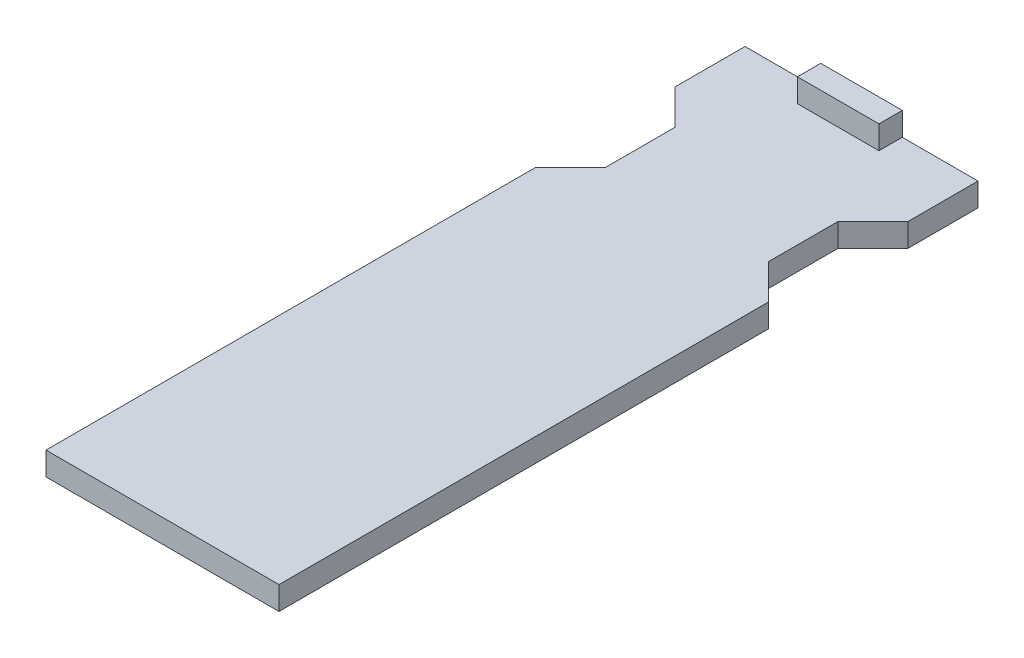
ISO-10303-21;
HEADER;
FILE_DESCRIPTION(('STEP AP214'),'2;1');
FILE_NAME('part.step','',(''),(''),'','','');
FILE_SCHEMA(('AUTOMOTIVE_DESIGN { 1 0 10303 214 1 1 1 1 }'));
ENDSEC;
DATA;
#1=APPLICATION_CONTEXT('core data for automotive mechanical design processes');
#2=APPLICATION_PROTOCOL_DEFINITION('international standard','automotive_design',2000,#1);
#3=PRODUCT_CONTEXT('',#1,'mechanical');
#4=PRODUCT('Part','Part','',(#3));
#5=PRODUCT_RELATED_PRODUCT_CATEGORY('part','',(#4));
#6=PRODUCT_DEFINITION_FORMATION('','',#4);
#7=PRODUCT_DEFINITION_CONTEXT('part definition',#1,'design');
#8=PRODUCT_DEFINITION('design','',#6,#7);
#9=PRODUCT_DEFINITION_SHAPE('','',#8);
#10=(LENGTH_UNIT() NAMED_UNIT(*) SI_UNIT(.MILLI.,.METRE.));
#11=(NAMED_UNIT(*) PLANE_ANGLE_UNIT() SI_UNIT($,.RADIAN.));
#12=(NAMED_UNIT(*) SI_UNIT($,.STERADIAN.) SOLID_ANGLE_UNIT());
#13=UNCERTAINTY_MEASURE_WITH_UNIT(LENGTH_MEASURE(1.E-05),#10,'distance_accuracy_value','');
#14=(GEOMETRIC_REPRESENTATION_CONTEXT(3) GLOBAL_UNCERTAINTY_ASSIGNED_CONTEXT((#13)) GLOBAL_UNIT_ASSIGNED_CONTEXT((#10,
#11,#12)) REPRESENTATION_CONTEXT('',''));
#15=CARTESIAN_POINT('',(0.,0.,0.));
#16=DIRECTION('',(0.,0.,1.));
#17=DIRECTION('',(1.,0.,0.));
#18=AXIS2_PLACEMENT_3D('',#15,#16,#17);
#19=CARTESIAN_POINT('',(6.5,4.,-60.));
#20=DIRECTION('',(1.,0.,0.));
#21=DIRECTION('',(0.,0.,-1.));
#22=AXIS2_PLACEMENT_3D('',#19,#20,#21);
#23=PLANE('',#22);
#24=DIRECTION('',(0.,0.,1.));
#25=VECTOR('',#24,1.);
#26=CARTESIAN_POINT('',(6.5,2.,-60.));
#27=LINE('',#26,#25);
#28=CARTESIAN_POINT('',(6.5,2.,-60.));
#29=VERTEX_POINT('',#28);
#30=CARTESIAN_POINT('',(6.5,2.,-58.));
#31=VERTEX_POINT('',#30);
#32=EDGE_CURVE('E108',#29,#31,#27,.T.);
#33=ORIENTED_EDGE('',*,*,#32,.T.);
#34=DIRECTION('',(0.,-1.,0.));
#35=VECTOR('',#34,1.);
#36=CARTESIAN_POINT('',(6.5,4.,-58.));
#37=LINE('',#36,#35);
#38=CARTESIAN_POINT('',(6.5,4.,-58.));
#39=VERTEX_POINT('',#38);
#40=EDGE_CURVE('E12',#39,#31,#37,.T.);
#41=ORIENTED_EDGE('',*,*,#40,.F.);
#42=DIRECTION('',(0.,0.,1.));
#43=VECTOR('',#42,1.);
#44=CARTESIAN_POINT('',(6.5,4.,-60.));
#45=LINE('',#44,#43);
#46=CARTESIAN_POINT('',(6.5,4.,-60.));
#47=VERTEX_POINT('',#46);
#48=EDGE_CURVE('E96',#47,#39,#45,.T.);
#49=ORIENTED_EDGE('',*,*,#48,.F.);
#50=DIRECTION('',(0.,-1.,0.));
#51=VECTOR('',#50,1.);
#52=CARTESIAN_POINT('',(6.5,4.,-60.));
#53=LINE('',#52,#51);
#54=EDGE_CURVE('E104',#47,#29,#53,.T.);
#55=ORIENTED_EDGE('',*,*,#54,.T.);
#56=EDGE_LOOP('',(#33,#41,#49,#55));
#57=FACE_BOUND('',#56,.T.);
#58=ADVANCED_FACE('F45',(#57),#23,.F.);
#59=CARTESIAN_POINT('',(6.5,4.,-58.));
#60=DIRECTION('',(0.,0.,-1.));
#61=DIRECTION('',(-1.,0.,0.));
#62=AXIS2_PLACEMENT_3D('',#59,#60,#61);
#63=PLANE('',#62);
#64=DIRECTION('',(1.,0.,0.));
#65=VECTOR('',#64,1.);
#66=CARTESIAN_POINT('',(6.5,2.,-58.));
#67=LINE('',#66,#65);
#68=CARTESIAN_POINT('',(13.5,2.,-58.));
#69=VERTEX_POINT('',#68);
#70=EDGE_CURVE('E100',#31,#69,#67,.T.);
#71=ORIENTED_EDGE('',*,*,#70,.T.);
#72=DIRECTION('',(0.,-1.,0.));
#73=VECTOR('',#72,1.);
#74=CARTESIAN_POINT('',(13.5,4.,-58.));
#75=LINE('',#74,#73);
#76=CARTESIAN_POINT('',(13.5,4.,-58.));
#77=VERTEX_POINT('',#76);
#78=EDGE_CURVE('E53',#77,#69,#75,.T.);
#79=ORIENTED_EDGE('',*,*,#78,.F.);
#80=DIRECTION('',(1.,0.,0.));
#81=VECTOR('',#80,1.);
#82=CARTESIAN_POINT('',(6.5,4.,-58.));
#83=LINE('',#82,#81);
#84=EDGE_CURVE('E91',#39,#77,#83,.T.);
#85=ORIENTED_EDGE('',*,*,#84,.F.);
#86=ORIENTED_EDGE('',*,*,#40,.T.);
#87=EDGE_LOOP('',(#71,#79,#85,#86));
#88=FACE_BOUND('',#87,.T.);
#89=ADVANCED_FACE('F99',(#88),#63,.F.);
#90=CARTESIAN_POINT('',(13.5,4.,-60.));
#91=DIRECTION('',(-1.,0.,0.));
#92=DIRECTION('',(0.,0.,1.));
#93=AXIS2_PLACEMENT_3D('',#90,#91,#92);
#94=PLANE('',#93);
#95=DIRECTION('',(0.,0.,-1.));
#96=VECTOR('',#95,1.);
#97=CARTESIAN_POINT('',(13.5,2.,-60.));
#98=LINE('',#97,#96);
#99=CARTESIAN_POINT('',(13.5,2.,-60.));
#100=VERTEX_POINT('',#99);
#101=EDGE_CURVE('E78',#69,#100,#98,.T.);
#102=ORIENTED_EDGE('',*,*,#101,.T.);
#103=DIRECTION('',(0.,-1.,0.));
#104=VECTOR('',#103,1.);
#105=CARTESIAN_POINT('',(13.5,4.,-60.));
#106=LINE('',#105,#104);
#107=CARTESIAN_POINT('',(13.5,4.,-60.));
#108=VERTEX_POINT('',#107);
#109=EDGE_CURVE('E101',#108,#100,#106,.T.);
#110=ORIENTED_EDGE('',*,*,#109,.F.);
#111=DIRECTION('',(0.,0.,-1.));
#112=VECTOR('',#111,1.);
#113=CARTESIAN_POINT('',(13.5,4.,-60.));
#114=LINE('',#113,#112);
#115=EDGE_CURVE('E94',#77,#108,#114,.T.);
#116=ORIENTED_EDGE('',*,*,#115,.F.);
#117=ORIENTED_EDGE('',*,*,#78,.T.);
#118=EDGE_LOOP('',(#102,#110,#116,#117));
#119=FACE_BOUND('',#118,.T.);
#120=ADVANCED_FACE('F102',(#119),#94,.F.);
#121=CARTESIAN_POINT('',(6.5,4.,-60.));
#122=DIRECTION('',(0.,0.,1.));
#123=DIRECTION('',(1.,0.,0.));
#124=AXIS2_PLACEMENT_3D('',#121,#122,#123);
#125=PLANE('',#124);
#126=DIRECTION('',(-1.,0.,0.));
#127=VECTOR('',#126,1.);
#128=CARTESIAN_POINT('',(6.5,2.,-60.));
#129=LINE('',#128,#127);
#130=EDGE_CURVE('E84',#100,#29,#129,.T.);
#131=ORIENTED_EDGE('',*,*,#130,.T.);
#132=ORIENTED_EDGE('',*,*,#54,.F.);
#133=DIRECTION('',(-1.,0.,0.));
#134=VECTOR('',#133,1.);
#135=CARTESIAN_POINT('',(6.5,4.,-60.));
#136=LINE('',#135,#134);
#137=EDGE_CURVE('E61',#108,#47,#136,.T.);
#138=ORIENTED_EDGE('',*,*,#137,.F.);
#139=ORIENTED_EDGE('',*,*,#109,.T.);
#140=EDGE_LOOP('',(#131,#132,#138,#139));
#141=FACE_BOUND('',#140,.T.);
#142=ADVANCED_FACE('F115',(#141),#125,.F.);
#143=CARTESIAN_POINT('',(0.,4.,0.));
#144=DIRECTION('',(0.,1.,0.));
#145=DIRECTION('',(0.,0.,1.));
#146=AXIS2_PLACEMENT_3D('',#143,#144,#145);
#147=PLANE('',#146);
#148=ORIENTED_EDGE('',*,*,#48,.T.);
#149=ORIENTED_EDGE('',*,*,#84,.T.);
#150=ORIENTED_EDGE('',*,*,#115,.T.);
#151=ORIENTED_EDGE('',*,*,#137,.T.);
#152=EDGE_LOOP('',(#148,#149,#150,#151));
#153=FACE_BOUND('',#152,.T.);
#154=ADVANCED_FACE('F92',(#153),#147,.T.);
#155=CARTESIAN_POINT('',(0.,2.,0.));
#156=DIRECTION('',(0.,1.,0.));
#157=DIRECTION('',(0.,0.,1.));
#158=AXIS2_PLACEMENT_3D('',#155,#156,#157);
#159=PLANE('',#158);
#160=ORIENTED_EDGE('',*,*,#32,.F.);
#161=ORIENTED_EDGE('',*,*,#130,.F.);
#162=ORIENTED_EDGE('',*,*,#101,.F.);
#163=ORIENTED_EDGE('',*,*,#70,.F.);
#164=EDGE_LOOP('',(#160,#161,#162,#163));
#165=FACE_BOUND('',#164,.T.);
#166=ADVANCED_FACE('F118',(#165),#159,.F.);
#167=CLOSED_SHELL('',(#58,#89,#120,#142,#154,#166));
#168=MANIFOLD_SOLID_BREP('B2',#167);
#169=CARTESIAN_POINT('',(0.,2.,0.));
#170=DIRECTION('',(0.,0.,-1.));
#171=DIRECTION('',(-1.,0.,0.));
#172=AXIS2_PLACEMENT_3D('',#169,#170,#171);
#173=PLANE('',#172);
#174=DIRECTION('',(1.,0.,0.));
#175=VECTOR('',#174,1.);
#176=CARTESIAN_POINT('',(0.,0.,0.));
#177=LINE('',#176,#175);
#178=CARTESIAN_POINT('',(0.,0.,0.));
#179=VERTEX_POINT('',#178);
#180=CARTESIAN_POINT('',(20.,0.,0.));
#181=VERTEX_POINT('',#180);
#182=EDGE_CURVE('E289',#179,#181,#177,.T.);
#183=ORIENTED_EDGE('',*,*,#182,.T.);
#184=DIRECTION('',(0.,-1.,0.));
#185=VECTOR('',#184,1.);
#186=CARTESIAN_POINT('',(20.,2.,0.));
#187=LINE('',#186,#185);
#188=CARTESIAN_POINT('',(20.,2.,0.));
#189=VERTEX_POINT('',#188);
#190=EDGE_CURVE('E43',#189,#181,#187,.T.);
#191=ORIENTED_EDGE('',*,*,#190,.F.);
#192=DIRECTION('',(1.,0.,0.));
#193=VECTOR('',#192,1.);
#194=CARTESIAN_POINT('',(0.,2.,0.));
#195=LINE('',#194,#193);
#196=CARTESIAN_POINT('',(0.,2.,0.));
#197=VERTEX_POINT('',#196);
#198=EDGE_CURVE('E311',#197,#189,#195,.T.);
#199=ORIENTED_EDGE('',*,*,#198,.F.);
#200=DIRECTION('',(0.,-1.,0.));
#201=VECTOR('',#200,1.);
#202=CARTESIAN_POINT('',(0.,2.,0.));
#203=LINE('',#202,#201);
#204=EDGE_CURVE('E285',#197,#179,#203,.T.);
#205=ORIENTED_EDGE('',*,*,#204,.T.);
#206=EDGE_LOOP('',(#183,#191,#199,#205));
#207=FACE_BOUND('',#206,.T.);
#208=ADVANCED_FACE('F169',(#207),#173,.F.);
#209=CARTESIAN_POINT('',(20.,2.,0.));
#210=DIRECTION('',(-1.,0.,0.));
#211=DIRECTION('',(0.,0.,1.));
#212=AXIS2_PLACEMENT_3D('',#209,#210,#211);
#213=PLANE('',#212);
#214=DIRECTION('',(0.,0.,-1.));
#215=VECTOR('',#214,1.);
#216=CARTESIAN_POINT('',(20.,0.,0.));
#217=LINE('',#216,#215);
#218=CARTESIAN_POINT('',(20.,0.,-42.));
#219=VERTEX_POINT('',#218);
#220=EDGE_CURVE('E292',#181,#219,#217,.T.);
#221=ORIENTED_EDGE('',*,*,#220,.T.);
#222=DIRECTION('',(0.,-1.,0.));
#223=VECTOR('',#222,1.);
#224=CARTESIAN_POINT('',(20.,2.,-42.));
#225=LINE('',#224,#223);
#226=CARTESIAN_POINT('',(20.,2.,-42.));
#227=VERTEX_POINT('',#226);
#228=EDGE_CURVE('E177',#227,#219,#225,.T.);
#229=ORIENTED_EDGE('',*,*,#228,.F.);
#230=DIRECTION('',(0.,0.,-1.));
#231=VECTOR('',#230,1.);
#232=CARTESIAN_POINT('',(20.,2.,0.));
#233=LINE('',#232,#231);
#234=EDGE_CURVE('E240',#189,#227,#233,.T.);
#235=ORIENTED_EDGE('',*,*,#234,.F.);
#236=ORIENTED_EDGE('',*,*,#190,.T.);
#237=EDGE_LOOP('',(#221,#229,#235,#236));
#238=FACE_BOUND('',#237,.T.);
#239=ADVANCED_FACE('F389',(#238),#213,.F.);
#240=CARTESIAN_POINT('',(20.,2.,-42.));
#241=DIRECTION('',(-0.707106781186548,0.,0.707106781186547));
#242=DIRECTION('',(0.707106781186547,0.,0.707106781186548));
#243=AXIS2_PLACEMENT_3D('',#240,#241,#242);
#244=PLANE('',#243);
#245=DIRECTION('',(-0.707106781186547,0.,-0.707106781186548));
#246=VECTOR('',#245,1.);
#247=CARTESIAN_POINT('',(20.,0.,-42.));
#248=LINE('',#247,#246);
#249=CARTESIAN_POINT('',(17.,0.,-45.));
#250=VERTEX_POINT('',#249);
#251=EDGE_CURVE('E294',#219,#250,#248,.T.);
#252=ORIENTED_EDGE('',*,*,#251,.T.);
#253=DIRECTION('',(0.,-1.,0.));
#254=VECTOR('',#253,1.);
#255=CARTESIAN_POINT('',(17.,2.,-45.));
#256=LINE('',#255,#254);
#257=CARTESIAN_POINT('',(17.,2.,-45.));
#258=VERTEX_POINT('',#257);
#259=EDGE_CURVE('E330',#258,#250,#256,.T.);
#260=ORIENTED_EDGE('',*,*,#259,.F.);
#261=DIRECTION('',(-0.707106781186547,0.,-0.707106781186548));
#262=VECTOR('',#261,1.);
#263=CARTESIAN_POINT('',(20.,2.,-42.));
#264=LINE('',#263,#262);
#265=EDGE_CURVE('E338',#227,#258,#264,.T.);
#266=ORIENTED_EDGE('',*,*,#265,.F.);
#267=ORIENTED_EDGE('',*,*,#228,.T.);
#268=EDGE_LOOP('',(#252,#260,#266,#267));
#269=FACE_BOUND('',#268,.T.);
#270=ADVANCED_FACE('F336',(#269),#244,.F.);
#271=CARTESIAN_POINT('',(17.,2.,-45.));
#272=DIRECTION('',(-1.,0.,0.));
#273=DIRECTION('',(0.,0.,1.));
#274=AXIS2_PLACEMENT_3D('',#271,#272,#273);
#275=PLANE('',#274);
#276=DIRECTION('',(0.,0.,-1.));
#277=VECTOR('',#276,1.);
#278=CARTESIAN_POINT('',(17.,0.,-45.));
#279=LINE('',#278,#277);
#280=CARTESIAN_POINT('',(17.,0.,-51.));
#281=VERTEX_POINT('',#280);
#282=EDGE_CURVE('E296',#250,#281,#279,.T.);
#283=ORIENTED_EDGE('',*,*,#282,.T.);
#284=DIRECTION('',(0.,-1.,0.));
#285=VECTOR('',#284,1.);
#286=CARTESIAN_POINT('',(17.,2.,-51.));
#287=LINE('',#286,#285);
#288=CARTESIAN_POINT('',(17.,2.,-51.));
#289=VERTEX_POINT('',#288);
#290=EDGE_CURVE('E327',#289,#281,#287,.T.);
#291=ORIENTED_EDGE('',*,*,#290,.F.);
#292=DIRECTION('',(0.,0.,-1.));
#293=VECTOR('',#292,1.);
#294=CARTESIAN_POINT('',(17.,2.,-45.));
#295=LINE('',#294,#293);
#296=EDGE_CURVE('E356',#258,#289,#295,.T.);
#297=ORIENTED_EDGE('',*,*,#296,.F.);
#298=ORIENTED_EDGE('',*,*,#259,.T.);
#299=EDGE_LOOP('',(#283,#291,#297,#298));
#300=FACE_BOUND('',#299,.T.);
#301=ADVANCED_FACE('F347',(#300),#275,.F.);
#302=CARTESIAN_POINT('',(17.,2.,-51.));
#303=DIRECTION('',(-0.707106781186547,0.,-0.707106781186548));
#304=DIRECTION('',(-0.707106781186548,0.,0.707106781186547));
#305=AXIS2_PLACEMENT_3D('',#302,#303,#304);
#306=PLANE('',#305);
#307=DIRECTION('',(0.707106781186548,0.,-0.707106781186547));
#308=VECTOR('',#307,1.);
#309=CARTESIAN_POINT('',(17.,0.,-51.));
#310=LINE('',#309,#308);
#311=CARTESIAN_POINT('',(20.,0.,-54.));
#312=VERTEX_POINT('',#311);
#313=EDGE_CURVE('E298',#281,#312,#310,.T.);
#314=ORIENTED_EDGE('',*,*,#313,.T.);
#315=DIRECTION('',(0.,-1.,0.));
#316=VECTOR('',#315,1.);
#317=CARTESIAN_POINT('',(20.,2.,-54.));
#318=LINE('',#317,#316);
#319=CARTESIAN_POINT('',(20.,2.,-54.));
#320=VERTEX_POINT('',#319);
#321=EDGE_CURVE('E324',#320,#312,#318,.T.);
#322=ORIENTED_EDGE('',*,*,#321,.F.);
#323=DIRECTION('',(0.707106781186548,0.,-0.707106781186547));
#324=VECTOR('',#323,1.);
#325=CARTESIAN_POINT('',(17.,2.,-51.));
#326=LINE('',#325,#324);
#327=EDGE_CURVE('E353',#289,#320,#326,.T.);
#328=ORIENTED_EDGE('',*,*,#327,.F.);
#329=ORIENTED_EDGE('',*,*,#290,.T.);
#330=EDGE_LOOP('',(#314,#322,#328,#329));
#331=FACE_BOUND('',#330,.T.);
#332=ADVANCED_FACE('F351',(#331),#306,.F.);
#333=CARTESIAN_POINT('',(20.,2.,-54.));
#334=DIRECTION('',(-1.,0.,0.));
#335=DIRECTION('',(0.,0.,1.));
#336=AXIS2_PLACEMENT_3D('',#333,#334,#335);
#337=PLANE('',#336);
#338=DIRECTION('',(0.,0.,-1.));
#339=VECTOR('',#338,1.);
#340=CARTESIAN_POINT('',(20.,0.,-54.));
#341=LINE('',#340,#339);
#342=CARTESIAN_POINT('',(20.,0.,-60.));
#343=VERTEX_POINT('',#342);
#344=EDGE_CURVE('E300',#312,#343,#341,.T.);
#345=ORIENTED_EDGE('',*,*,#344,.T.);
#346=DIRECTION('',(0.,-1.,0.));
#347=VECTOR('',#346,1.);
#348=CARTESIAN_POINT('',(20.,2.,-60.));
#349=LINE('',#348,#347);
#350=CARTESIAN_POINT('',(20.,2.,-60.));
#351=VERTEX_POINT('',#350);
#352=EDGE_CURVE('E321',#351,#343,#349,.T.);
#353=ORIENTED_EDGE('',*,*,#352,.F.);
#354=DIRECTION('',(0.,0.,-1.));
#355=VECTOR('',#354,1.);
#356=CARTESIAN_POINT('',(20.,2.,-54.));
#357=LINE('',#356,#355);
#358=EDGE_CURVE('E355',#320,#351,#357,.T.);
#359=ORIENTED_EDGE('',*,*,#358,.F.);
#360=ORIENTED_EDGE('',*,*,#321,.T.);
#361=EDGE_LOOP('',(#345,#353,#359,#360));
#362=FACE_BOUND('',#361,.T.);
#363=ADVANCED_FACE('F402',(#362),#337,.F.);
#364=CARTESIAN_POINT('',(20.,2.,-60.));
#365=DIRECTION('',(0.,0.,1.));
#366=DIRECTION('',(1.,0.,0.));
#367=AXIS2_PLACEMENT_3D('',#364,#365,#366);
#368=PLANE('',#367);
#369=DIRECTION('',(-1.,0.,0.));
#370=VECTOR('',#369,1.);
#371=CARTESIAN_POINT('',(20.,0.,-60.));
#372=LINE('',#371,#370);
#373=CARTESIAN_POINT('',(0.,0.,-60.));
#374=VERTEX_POINT('',#373);
#375=EDGE_CURVE('E302',#343,#374,#372,.T.);
#376=ORIENTED_EDGE('',*,*,#375,.T.);
#377=DIRECTION('',(0.,-1.,0.));
#378=VECTOR('',#377,1.);
#379=CARTESIAN_POINT('',(0.,2.,-60.));
#380=LINE('',#379,#378);
#381=CARTESIAN_POINT('',(0.,2.,-60.));
#382=VERTEX_POINT('',#381);
#383=EDGE_CURVE('E318',#382,#374,#380,.T.);
#384=ORIENTED_EDGE('',*,*,#383,.F.);
#385=DIRECTION('',(-1.,0.,0.));
#386=VECTOR('',#385,1.);
#387=CARTESIAN_POINT('',(20.,2.,-60.));
#388=LINE('',#387,#386);
#389=EDGE_CURVE('E358',#351,#382,#388,.T.);
#390=ORIENTED_EDGE('',*,*,#389,.F.);
#391=ORIENTED_EDGE('',*,*,#352,.T.);
#392=EDGE_LOOP('',(#376,#384,#390,#391));
#393=FACE_BOUND('',#392,.T.);
#394=ADVANCED_FACE('F405',(#393),#368,.F.);
#395=CARTESIAN_POINT('',(0.,2.,-60.));
#396=DIRECTION('',(1.,0.,0.));
#397=DIRECTION('',(0.,0.,-1.));
#398=AXIS2_PLACEMENT_3D('',#395,#396,#397);
#399=PLANE('',#398);
#400=DIRECTION('',(0.,0.,1.));
#401=VECTOR('',#400,1.);
#402=CARTESIAN_POINT('',(0.,0.,-60.));
#403=LINE('',#402,#401);
#404=CARTESIAN_POINT('',(0.,0.,-54.));
#405=VERTEX_POINT('',#404);
#406=EDGE_CURVE('E304',#374,#405,#403,.T.);
#407=ORIENTED_EDGE('',*,*,#406,.T.);
#408=DIRECTION('',(0.,-1.,0.));
#409=VECTOR('',#408,1.);
#410=CARTESIAN_POINT('',(0.,2.,-54.));
#411=LINE('',#410,#409);
#412=CARTESIAN_POINT('',(0.,2.,-54.));
#413=VERTEX_POINT('',#412);
#414=EDGE_CURVE('E315',#413,#405,#411,.T.);
#415=ORIENTED_EDGE('',*,*,#414,.F.);
#416=DIRECTION('',(0.,0.,1.));
#417=VECTOR('',#416,1.);
#418=CARTESIAN_POINT('',(0.,2.,-60.));
#419=LINE('',#418,#417);
#420=EDGE_CURVE('E364',#382,#413,#419,.T.);
#421=ORIENTED_EDGE('',*,*,#420,.F.);
#422=ORIENTED_EDGE('',*,*,#383,.T.);
#423=EDGE_LOOP('',(#407,#415,#421,#422));
#424=FACE_BOUND('',#423,.T.);
#425=ADVANCED_FACE('F370',(#424),#399,.F.);
#426=CARTESIAN_POINT('',(0.,2.,-54.));
#427=DIRECTION('',(0.707106781186548,0.,-0.707106781186547));
#428=DIRECTION('',(-0.707106781186547,0.,-0.707106781186548));
#429=AXIS2_PLACEMENT_3D('',#426,#427,#428);
#430=PLANE('',#429);
#431=DIRECTION('',(0.707106781186547,0.,0.707106781186548));
#432=VECTOR('',#431,1.);
#433=CARTESIAN_POINT('',(0.,0.,-54.));
#434=LINE('',#433,#432);
#435=CARTESIAN_POINT('',(3.,0.,-51.));
#436=VERTEX_POINT('',#435);
#437=EDGE_CURVE('E306',#405,#436,#434,.T.);
#438=ORIENTED_EDGE('',*,*,#437,.T.);
#439=DIRECTION('',(0.,-1.,0.));
#440=VECTOR('',#439,1.);
#441=CARTESIAN_POINT('',(3.,2.,-51.));
#442=LINE('',#441,#440);
#443=CARTESIAN_POINT('',(3.,2.,-51.));
#444=VERTEX_POINT('',#443);
#445=EDGE_CURVE('E280',#444,#436,#442,.T.);
#446=ORIENTED_EDGE('',*,*,#445,.F.);
#447=DIRECTION('',(0.707106781186547,0.,0.707106781186548));
#448=VECTOR('',#447,1.);
#449=CARTESIAN_POINT('',(0.,2.,-54.));
#450=LINE('',#449,#448);
#451=EDGE_CURVE('E271',#413,#444,#450,.T.);
#452=ORIENTED_EDGE('',*,*,#451,.F.);
#453=ORIENTED_EDGE('',*,*,#414,.T.);
#454=EDGE_LOOP('',(#438,#446,#452,#453));
#455=FACE_BOUND('',#454,.T.);
#456=ADVANCED_FACE('F374',(#455),#430,.F.);
#457=CARTESIAN_POINT('',(3.,2.,-51.));
#458=DIRECTION('',(1.,0.,0.));
#459=DIRECTION('',(0.,0.,-1.));
#460=AXIS2_PLACEMENT_3D('',#457,#458,#459);
#461=PLANE('',#460);
#462=DIRECTION('',(0.,0.,1.));
#463=VECTOR('',#462,1.);
#464=CARTESIAN_POINT('',(3.,0.,-51.));
#465=LINE('',#464,#463);
#466=CARTESIAN_POINT('',(3.,0.,-45.));
#467=VERTEX_POINT('',#466);
#468=EDGE_CURVE('E279',#436,#467,#465,.T.);
#469=ORIENTED_EDGE('',*,*,#468,.T.);
#470=DIRECTION('',(0.,-1.,0.));
#471=VECTOR('',#470,1.);
#472=CARTESIAN_POINT('',(3.,2.,-45.));
#473=LINE('',#472,#471);
#474=CARTESIAN_POINT('',(3.,2.,-45.));
#475=VERTEX_POINT('',#474);
#476=EDGE_CURVE('E276',#475,#467,#473,.T.);
#477=ORIENTED_EDGE('',*,*,#476,.F.);
#478=DIRECTION('',(0.,0.,1.));
#479=VECTOR('',#478,1.);
#480=CARTESIAN_POINT('',(3.,2.,-51.));
#481=LINE('',#480,#479);
#482=EDGE_CURVE('E265',#444,#475,#481,.T.);
#483=ORIENTED_EDGE('',*,*,#482,.F.);
#484=ORIENTED_EDGE('',*,*,#445,.T.);
#485=EDGE_LOOP('',(#469,#477,#483,#484));
#486=FACE_BOUND('',#485,.T.);
#487=ADVANCED_FACE('F277',(#486),#461,.F.);
#488=CARTESIAN_POINT('',(3.,2.,-45.));
#489=DIRECTION('',(0.707106781186548,0.,0.707106781186547));
#490=DIRECTION('',(0.707106781186547,0.,-0.707106781186548));
#491=AXIS2_PLACEMENT_3D('',#488,#489,#490);
#492=PLANE('',#491);
#493=DIRECTION('',(-0.707106781186547,0.,0.707106781186548));
#494=VECTOR('',#493,1.);
#495=CARTESIAN_POINT('',(3.,0.,-45.));
#496=LINE('',#495,#494);
#497=CARTESIAN_POINT('',(0.,0.,-42.));
#498=VERTEX_POINT('',#497);
#499=EDGE_CURVE('E226',#467,#498,#496,.T.);
#500=ORIENTED_EDGE('',*,*,#499,.T.);
#501=DIRECTION('',(0.,-1.,0.));
#502=VECTOR('',#501,1.);
#503=CARTESIAN_POINT('',(0.,2.,-42.));
#504=LINE('',#503,#502);
#505=CARTESIAN_POINT('',(0.,2.,-42.));
#506=VERTEX_POINT('',#505);
#507=EDGE_CURVE('E281',#506,#498,#504,.T.);
#508=ORIENTED_EDGE('',*,*,#507,.F.);
#509=DIRECTION('',(-0.707106781186547,0.,0.707106781186548));
#510=VECTOR('',#509,1.);
#511=CARTESIAN_POINT('',(3.,2.,-45.));
#512=LINE('',#511,#510);
#513=EDGE_CURVE('E269',#475,#506,#512,.T.);
#514=ORIENTED_EDGE('',*,*,#513,.F.);
#515=ORIENTED_EDGE('',*,*,#476,.T.);
#516=EDGE_LOOP('',(#500,#508,#514,#515));
#517=FACE_BOUND('',#516,.T.);
#518=ADVANCED_FACE('F283',(#517),#492,.F.);
#519=CARTESIAN_POINT('',(0.,2.,-42.));
#520=DIRECTION('',(1.,0.,0.));
#521=DIRECTION('',(0.,0.,-1.));
#522=AXIS2_PLACEMENT_3D('',#519,#520,#521);
#523=PLANE('',#522);
#524=DIRECTION('',(0.,0.,1.));
#525=VECTOR('',#524,1.);
#526=CARTESIAN_POINT('',(0.,0.,-42.));
#527=LINE('',#526,#525);
#528=EDGE_CURVE('E232',#498,#179,#527,.T.);
#529=ORIENTED_EDGE('',*,*,#528,.T.);
#530=ORIENTED_EDGE('',*,*,#204,.F.);
#531=DIRECTION('',(0.,0.,1.));
#532=VECTOR('',#531,1.);
#533=CARTESIAN_POINT('',(0.,2.,-42.));
#534=LINE('',#533,#532);
#535=EDGE_CURVE('E185',#506,#197,#534,.T.);
#536=ORIENTED_EDGE('',*,*,#535,.F.);
#537=ORIENTED_EDGE('',*,*,#507,.T.);
#538=EDGE_LOOP('',(#529,#530,#536,#537));
#539=FACE_BOUND('',#538,.T.);
#540=ADVANCED_FACE('F378',(#539),#523,.F.);
#541=CARTESIAN_POINT('',(0.,2.,0.));
#542=DIRECTION('',(0.,1.,0.));
#543=DIRECTION('',(0.,0.,1.));
#544=AXIS2_PLACEMENT_3D('',#541,#542,#543);
#545=PLANE('',#544);
#546=ORIENTED_EDGE('',*,*,#198,.T.);
#547=ORIENTED_EDGE('',*,*,#234,.T.);
#548=ORIENTED_EDGE('',*,*,#265,.T.);
#549=ORIENTED_EDGE('',*,*,#296,.T.);
#550=ORIENTED_EDGE('',*,*,#327,.T.);
#551=ORIENTED_EDGE('',*,*,#358,.T.);
#552=ORIENTED_EDGE('',*,*,#389,.T.);
#553=ORIENTED_EDGE('',*,*,#420,.T.);
#554=ORIENTED_EDGE('',*,*,#451,.T.);
#555=ORIENTED_EDGE('',*,*,#482,.T.);
#556=ORIENTED_EDGE('',*,*,#513,.T.);
#557=ORIENTED_EDGE('',*,*,#535,.T.);
#558=EDGE_LOOP('',(#546,#547,#548,#549,#550,#551,#552,#553,#554,#555,#556,#557));
#559=FACE_BOUND('',#558,.T.);
#560=ADVANCED_FACE('F267',(#559),#545,.T.);
#561=CARTESIAN_POINT('',(0.,0.,0.));
#562=DIRECTION('',(0.,1.,0.));
#563=DIRECTION('',(0.,0.,1.));
#564=AXIS2_PLACEMENT_3D('',#561,#562,#563);
#565=PLANE('',#564);
#566=ORIENTED_EDGE('',*,*,#182,.F.);
#567=ORIENTED_EDGE('',*,*,#528,.F.);
#568=ORIENTED_EDGE('',*,*,#499,.F.);
#569=ORIENTED_EDGE('',*,*,#468,.F.);
#570=ORIENTED_EDGE('',*,*,#437,.F.);
#571=ORIENTED_EDGE('',*,*,#406,.F.);
#572=ORIENTED_EDGE('',*,*,#375,.F.);
#573=ORIENTED_EDGE('',*,*,#344,.F.);
#574=ORIENTED_EDGE('',*,*,#313,.F.);
#575=ORIENTED_EDGE('',*,*,#282,.F.);
#576=ORIENTED_EDGE('',*,*,#251,.F.);
#577=ORIENTED_EDGE('',*,*,#220,.F.);
#578=EDGE_LOOP('',(#566,#567,#568,#569,#570,#571,#572,#573,#574,#575,#576,#577));
#579=FACE_BOUND('',#578,.T.);
#580=ADVANCED_FACE('F342',(#579),#565,.F.);
#581=CLOSED_SHELL('',(#208,#239,#270,#301,#332,#363,#394,#425,#456,#487,#518,#540,#560,#580));
#582=MANIFOLD_SOLID_BREP('B6',#581);
#583=ADVANCED_BREP_SHAPE_REPRESENTATION('',(#18,#168,#582),#14);
#584=SHAPE_DEFINITION_REPRESENTATION(#9,#583);
ENDSEC;
END-ISO-10303-21;
